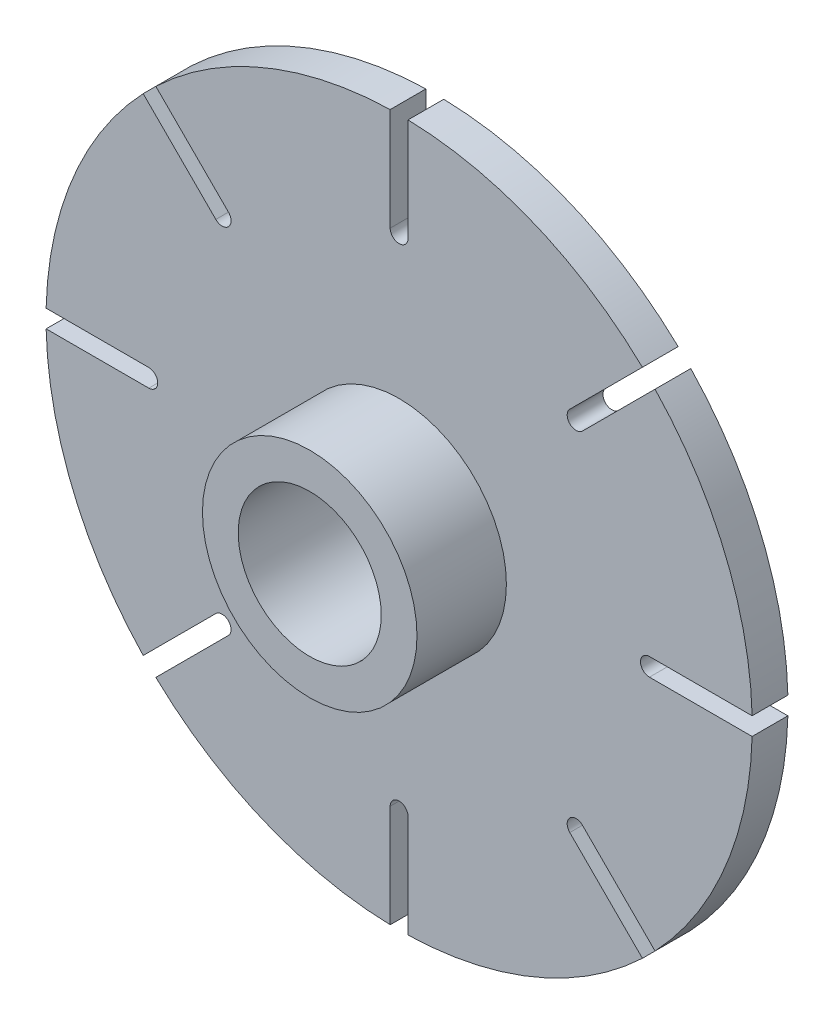
ISO-10303-21;
HEADER;
FILE_DESCRIPTION(('STEP AP214'),'2;1');
FILE_NAME('part.step','',(''),(''),'','','');
FILE_SCHEMA(('AUTOMOTIVE_DESIGN { 1 0 10303 214 1 1 1 1 }'));
ENDSEC;
DATA;
#1=APPLICATION_CONTEXT('core data for automotive mechanical design processes');
#2=APPLICATION_PROTOCOL_DEFINITION('international standard','automotive_design',2000,#1);
#3=PRODUCT_CONTEXT('',#1,'mechanical');
#4=PRODUCT('Part','Part','',(#3));
#5=PRODUCT_RELATED_PRODUCT_CATEGORY('part','',(#4));
#6=PRODUCT_DEFINITION_FORMATION('','',#4);
#7=PRODUCT_DEFINITION_CONTEXT('part definition',#1,'design');
#8=PRODUCT_DEFINITION('design','',#6,#7);
#9=PRODUCT_DEFINITION_SHAPE('','',#8);
#10=(LENGTH_UNIT() NAMED_UNIT(*) SI_UNIT(.MILLI.,.METRE.));
#11=(NAMED_UNIT(*) PLANE_ANGLE_UNIT() SI_UNIT($,.RADIAN.));
#12=(NAMED_UNIT(*) SI_UNIT($,.STERADIAN.) SOLID_ANGLE_UNIT());
#13=UNCERTAINTY_MEASURE_WITH_UNIT(LENGTH_MEASURE(1.E-05),#10,'distance_accuracy_value','');
#14=(GEOMETRIC_REPRESENTATION_CONTEXT(3) GLOBAL_UNCERTAINTY_ASSIGNED_CONTEXT((#13)) GLOBAL_UNIT_ASSIGNED_CONTEXT((#10,
#11,#12)) REPRESENTATION_CONTEXT('',''));
#15=CARTESIAN_POINT('',(0.,0.,0.));
#16=DIRECTION('',(0.,0.,1.));
#17=DIRECTION('',(1.,0.,0.));
#18=AXIS2_PLACEMENT_3D('',#15,#16,#17);
#19=CARTESIAN_POINT('',(0.,0.,7.));
#20=DIRECTION('',(0.,0.,-1.));
#21=DIRECTION('',(-1.,0.,0.));
#22=AXIS2_PLACEMENT_3D('',#19,#20,#21);
#23=CYLINDRICAL_SURFACE('',#22,6.);
#24=CARTESIAN_POINT('',(0.,0.,7.));
#25=DIRECTION('',(0.,0.,1.));
#26=DIRECTION('',(1.,0.,0.));
#27=AXIS2_PLACEMENT_3D('',#24,#25,#26);
#28=CIRCLE('',#27,6.);
#29=CARTESIAN_POINT('',(6.,0.,7.));
#30=VERTEX_POINT('',#29);
#31=EDGE_CURVE('E42',#30,#30,#28,.T.);
#32=ORIENTED_EDGE('',*,*,#31,.F.);
#33=EDGE_LOOP('',(#32));
#34=FACE_BOUND('',#33,.T.);
#35=CARTESIAN_POINT('',(0.,0.,2.));
#36=DIRECTION('',(0.,0.,-1.));
#37=DIRECTION('',(-1.,0.,0.));
#38=AXIS2_PLACEMENT_3D('',#35,#36,#37);
#39=CIRCLE('',#38,6.);
#40=CARTESIAN_POINT('',(-6.,0.,2.));
#41=VERTEX_POINT('',#40);
#42=EDGE_CURVE('E11',#41,#41,#39,.T.);
#43=ORIENTED_EDGE('',*,*,#42,.F.);
#44=EDGE_LOOP('',(#43));
#45=FACE_BOUND('',#44,.T.);
#46=ADVANCED_FACE('F34',(#34,#45),#23,.T.);
#47=CARTESIAN_POINT('',(0.,0.,7.));
#48=DIRECTION('',(0.,0.,1.));
#49=DIRECTION('',(1.,0.,0.));
#50=AXIS2_PLACEMENT_3D('',#47,#48,#49);
#51=PLANE('',#50);
#52=ORIENTED_EDGE('',*,*,#31,.T.);
#53=EDGE_LOOP('',(#52));
#54=FACE_BOUND('',#53,.T.);
#55=CARTESIAN_POINT('',(0.,0.,7.));
#56=DIRECTION('',(0.,0.,1.));
#57=DIRECTION('',(1.,0.,0.));
#58=AXIS2_PLACEMENT_3D('',#55,#56,#57);
#59=CIRCLE('',#58,4.);
#60=CARTESIAN_POINT('',(4.,0.,7.));
#61=VERTEX_POINT('',#60);
#62=EDGE_CURVE('E414',#61,#61,#59,.T.);
#63=ORIENTED_EDGE('',*,*,#62,.F.);
#64=EDGE_LOOP('',(#63));
#65=FACE_BOUND('',#64,.T.);
#66=ADVANCED_FACE('F421',(#54,#65),#51,.T.);
#67=CARTESIAN_POINT('',(0.,0.,0.));
#68=DIRECTION('',(0.,0.,1.));
#69=DIRECTION('',(1.,0.,0.));
#70=AXIS2_PLACEMENT_3D('',#67,#68,#69);
#71=PLANE('',#70);
#72=CARTESIAN_POINT('',(0.,0.,0.));
#73=DIRECTION('',(0.,0.,1.));
#74=DIRECTION('',(1.,0.,0.));
#75=AXIS2_PLACEMENT_3D('',#72,#73,#74);
#76=CIRCLE('',#75,4.);
#77=CARTESIAN_POINT('',(4.,0.,0.));
#78=VERTEX_POINT('',#77);
#79=EDGE_CURVE('E349',#78,#78,#76,.T.);
#80=ORIENTED_EDGE('',*,*,#79,.T.);
#81=EDGE_LOOP('',(#80));
#82=FACE_BOUND('',#81,.T.);
#83=DIRECTION('',(0.,1.,0.));
#84=VECTOR('',#83,1.);
#85=CARTESIAN_POINT('',(-0.5,0.,0.));
#86=LINE('',#85,#84);
#87=CARTESIAN_POINT('',(-0.5,14.,0.));
#88=VERTEX_POINT('',#87);
#89=CARTESIAN_POINT('',(-0.5,19.7436698716323,0.));
#90=VERTEX_POINT('',#89);
#91=EDGE_CURVE('E277',#88,#90,#86,.T.);
#92=ORIENTED_EDGE('',*,*,#91,.F.);
#93=CARTESIAN_POINT('',(0.,14.,0.));
#94=DIRECTION('',(0.,0.,-1.));
#95=DIRECTION('',(-1.,0.,0.));
#96=AXIS2_PLACEMENT_3D('',#93,#94,#95);
#97=CIRCLE('',#96,0.500000000000001);
#98=CARTESIAN_POINT('',(0.5,14.,0.));
#99=VERTEX_POINT('',#98);
#100=EDGE_CURVE('E279',#99,#88,#97,.T.);
#101=ORIENTED_EDGE('',*,*,#100,.F.);
#102=DIRECTION('',(0.,1.,0.));
#103=VECTOR('',#102,1.);
#104=CARTESIAN_POINT('',(0.5,0.,0.));
#105=LINE('',#104,#103);
#106=CARTESIAN_POINT('',(0.5,19.7436698716323,0.));
#107=VERTEX_POINT('',#106);
#108=EDGE_CURVE('E281',#99,#107,#105,.T.);
#109=ORIENTED_EDGE('',*,*,#108,.T.);
#110=CARTESIAN_POINT('',(0.,0.,0.));
#111=DIRECTION('',(0.,0.,-1.));
#112=DIRECTION('',(-1.,0.,0.));
#113=AXIS2_PLACEMENT_3D('',#110,#111,#112);
#114=CIRCLE('',#113,19.75);
#115=CARTESIAN_POINT('',(13.607329461146,14.3144362423321,0.));
#116=VERTEX_POINT('',#115);
#117=EDGE_CURVE('E284',#107,#116,#114,.T.);
#118=ORIENTED_EDGE('',*,*,#117,.T.);
#119=DIRECTION('',(0.707106781186548,0.707106781186547,0.));
#120=VECTOR('',#119,1.);
#121=CARTESIAN_POINT('',(-0.353553390593023,0.353553390593023,0.));
#122=LINE('',#121,#120);
#123=CARTESIAN_POINT('',(9.545941546018,10.253048327204,0.));
#124=VERTEX_POINT('',#123);
#125=EDGE_CURVE('E287',#124,#116,#122,.T.);
#126=ORIENTED_EDGE('',*,*,#125,.F.);
#127=CARTESIAN_POINT('',(9.89949493661127,9.89949493661076,0.));
#128=DIRECTION('',(0.,0.,-1.));
#129=DIRECTION('',(-1.,0.,0.));
#130=AXIS2_PLACEMENT_3D('',#127,#128,#129);
#131=CIRCLE('',#130,0.500000000000001);
#132=CARTESIAN_POINT('',(10.2530483272045,9.54594154601749,0.));
#133=VERTEX_POINT('',#132);
#134=EDGE_CURVE('E292',#133,#124,#131,.T.);
#135=ORIENTED_EDGE('',*,*,#134,.F.);
#136=DIRECTION('',(0.707106781186548,0.707106781186547,0.));
#137=VECTOR('',#136,1.);
#138=CARTESIAN_POINT('',(0.353553390593525,-0.353553390593525,0.));
#139=LINE('',#138,#137);
#140=CARTESIAN_POINT('',(14.3144362423326,13.6073294611455,0.));
#141=VERTEX_POINT('',#140);
#142=EDGE_CURVE('E294',#133,#141,#139,.T.);
#143=ORIENTED_EDGE('',*,*,#142,.T.);
#144=CARTESIAN_POINT('',(19.743669871631,0.499999999998734,0.));
#145=VERTEX_POINT('',#144);
#146=EDGE_CURVE('E289',#141,#145,#114,.T.);
#147=ORIENTED_EDGE('',*,*,#146,.T.);
#148=DIRECTION('',(1.,0.,0.));
#149=VECTOR('',#148,1.);
#150=CARTESIAN_POINT('',(0.,0.499999999998738,0.));
#151=LINE('',#150,#149);
#152=CARTESIAN_POINT('',(13.9999999999987,0.499999999998735,0.));
#153=VERTEX_POINT('',#152);
#154=EDGE_CURVE('E297',#153,#145,#151,.T.);
#155=ORIENTED_EDGE('',*,*,#154,.F.);
#156=CARTESIAN_POINT('',(13.9999999999987,-1.26481988006818E-12,0.));
#157=DIRECTION('',(0.,0.,-1.));
#158=DIRECTION('',(-1.,0.,0.));
#159=AXIS2_PLACEMENT_3D('',#156,#157,#158);
#160=CIRCLE('',#159,0.500000000000001);
#161=CARTESIAN_POINT('',(13.9999999999987,-0.500000000001265,0.));
#162=VERTEX_POINT('',#161);
#163=EDGE_CURVE('E300',#162,#153,#160,.T.);
#164=ORIENTED_EDGE('',*,*,#163,.F.);
#165=DIRECTION('',(1.,0.,0.));
#166=VECTOR('',#165,1.);
#167=CARTESIAN_POINT('',(0.,-0.500000000001262,0.));
#168=LINE('',#167,#166);
#169=CARTESIAN_POINT('',(19.743669871631,-0.500000000001266,0.));
#170=VERTEX_POINT('',#169);
#171=EDGE_CURVE('E302',#162,#170,#168,.T.);
#172=ORIENTED_EDGE('',*,*,#171,.T.);
#173=CARTESIAN_POINT('',(14.3144362423308,-13.6073294611473,0.));
#174=VERTEX_POINT('',#173);
#175=EDGE_CURVE('E305',#170,#174,#114,.T.);
#176=ORIENTED_EDGE('',*,*,#175,.T.);
#177=DIRECTION('',(0.707106781186547,-0.707106781186548,0.));
#178=VECTOR('',#177,1.);
#179=CARTESIAN_POINT('',(0.353553390591735,0.353553390591735,0.));
#180=LINE('',#179,#178);
#181=CARTESIAN_POINT('',(10.2530483272027,-9.54594154601926,0.));
#182=VERTEX_POINT('',#181);
#183=EDGE_CURVE('E306',#182,#174,#180,.T.);
#184=ORIENTED_EDGE('',*,*,#183,.F.);
#185=CARTESIAN_POINT('',(9.89949493660944,-9.89949493661253,0.));
#186=DIRECTION('',(0.,0.,-1.));
#187=DIRECTION('',(-1.,0.,0.));
#188=AXIS2_PLACEMENT_3D('',#185,#186,#187);
#189=CIRCLE('',#188,0.500000000000001);
#190=CARTESIAN_POINT('',(9.54594154601617,-10.2530483272058,0.));
#191=VERTEX_POINT('',#190);
#192=EDGE_CURVE('E309',#191,#182,#189,.T.);
#193=ORIENTED_EDGE('',*,*,#192,.F.);
#194=DIRECTION('',(0.707106781186547,-0.707106781186548,0.));
#195=VECTOR('',#194,1.);
#196=CARTESIAN_POINT('',(-0.353553390594814,-0.353553390594813,0.));
#197=LINE('',#196,#195);
#198=CARTESIAN_POINT('',(13.6073294611442,-14.3144362423339,0.));
#199=VERTEX_POINT('',#198);
#200=EDGE_CURVE('E311',#191,#199,#197,.T.);
#201=ORIENTED_EDGE('',*,*,#200,.T.);
#202=CARTESIAN_POINT('',(0.499999999997418,-19.7436698716322,0.));
#203=VERTEX_POINT('',#202);
#204=EDGE_CURVE('E314',#199,#203,#114,.T.);
#205=ORIENTED_EDGE('',*,*,#204,.T.);
#206=DIRECTION('',(0.,-1.,0.));
#207=VECTOR('',#206,1.);
#208=CARTESIAN_POINT('',(0.49999999999742,0.,0.));
#209=LINE('',#208,#207);
#210=CARTESIAN_POINT('',(0.499999999997418,-13.9999999999999,0.));
#211=VERTEX_POINT('',#210);
#212=EDGE_CURVE('E315',#211,#203,#209,.T.);
#213=ORIENTED_EDGE('',*,*,#212,.F.);
#214=CARTESIAN_POINT('',(-2.58172190033E-12,-13.9999999999999,0.));
#215=DIRECTION('',(0.,0.,-1.));
#216=DIRECTION('',(-1.,0.,0.));
#217=AXIS2_PLACEMENT_3D('',#214,#215,#216);
#218=CIRCLE('',#217,0.5);
#219=CARTESIAN_POINT('',(-0.500000000002582,-13.9999999999999,0.));
#220=VERTEX_POINT('',#219);
#221=EDGE_CURVE('E318',#220,#211,#218,.T.);
#222=ORIENTED_EDGE('',*,*,#221,.F.);
#223=DIRECTION('',(0.,-1.,0.));
#224=VECTOR('',#223,1.);
#225=CARTESIAN_POINT('',(-0.50000000000258,0.,0.));
#226=LINE('',#225,#224);
#227=CARTESIAN_POINT('',(-0.500000000002582,-19.7436698716322,0.));
#228=VERTEX_POINT('',#227);
#229=EDGE_CURVE('E320',#220,#228,#226,.T.);
#230=ORIENTED_EDGE('',*,*,#229,.T.);
#231=CARTESIAN_POINT('',(-13.6073294611486,-14.314436242332,0.));
#232=VERTEX_POINT('',#231);
#233=EDGE_CURVE('E323',#228,#232,#114,.T.);
#234=ORIENTED_EDGE('',*,*,#233,.T.);
#235=DIRECTION('',(-0.707106781186548,-0.707106781186548,0.));
#236=VECTOR('',#235,1.);
#237=CARTESIAN_POINT('',(0.353553390591703,-0.353553390591703,0.));
#238=LINE('',#237,#236);
#239=CARTESIAN_POINT('',(-9.54594154602058,-10.253048327204,0.));
#240=VERTEX_POINT('',#239);
#241=EDGE_CURVE('E324',#240,#232,#238,.T.);
#242=ORIENTED_EDGE('',*,*,#241,.F.);
#243=CARTESIAN_POINT('',(-9.89949493661385,-9.89949493661071,0.));
#244=DIRECTION('',(0.,0.,-1.));
#245=DIRECTION('',(-1.,0.,0.));
#246=AXIS2_PLACEMENT_3D('',#243,#244,#245);
#247=CIRCLE('',#246,0.500000000000001);
#248=CARTESIAN_POINT('',(-10.2530483272071,-9.54594154601743,0.));
#249=VERTEX_POINT('',#248);
#250=EDGE_CURVE('E327',#249,#240,#247,.T.);
#251=ORIENTED_EDGE('',*,*,#250,.F.);
#252=DIRECTION('',(-0.707106781186548,-0.707106781186548,0.));
#253=VECTOR('',#252,1.);
#254=CARTESIAN_POINT('',(-0.353553390594846,0.353553390594846,0.));
#255=LINE('',#254,#253);
#256=CARTESIAN_POINT('',(-14.3144362423352,-13.6073294611455,0.));
#257=VERTEX_POINT('',#256);
#258=EDGE_CURVE('E329',#249,#257,#255,.T.);
#259=ORIENTED_EDGE('',*,*,#258,.T.);
#260=CARTESIAN_POINT('',(-19.7436698716335,-0.499999999998681,0.));
#261=VERTEX_POINT('',#260);
#262=EDGE_CURVE('E332',#257,#261,#114,.T.);
#263=ORIENTED_EDGE('',*,*,#262,.T.);
#264=DIRECTION('',(-1.,0.,0.));
#265=VECTOR('',#264,1.);
#266=CARTESIAN_POINT('',(0.,-0.499999999998682,0.));
#267=LINE('',#266,#265);
#268=CARTESIAN_POINT('',(-14.0000000000013,-0.499999999998681,0.));
#269=VERTEX_POINT('',#268);
#270=EDGE_CURVE('E333',#269,#261,#267,.T.);
#271=ORIENTED_EDGE('',*,*,#270,.F.);
#272=CARTESIAN_POINT('',(-14.0000000000013,1.31861652578063E-12,0.));
#273=DIRECTION('',(0.,0.,-1.));
#274=DIRECTION('',(-1.,0.,0.));
#275=AXIS2_PLACEMENT_3D('',#272,#273,#274);
#276=CIRCLE('',#275,0.500000000000001);
#277=CARTESIAN_POINT('',(-14.0000000000013,0.500000000001319,0.));
#278=VERTEX_POINT('',#277);
#279=EDGE_CURVE('E336',#278,#269,#276,.T.);
#280=ORIENTED_EDGE('',*,*,#279,.F.);
#281=DIRECTION('',(-1.,0.,0.));
#282=VECTOR('',#281,1.);
#283=CARTESIAN_POINT('',(0.,0.500000000001318,0.));
#284=LINE('',#283,#282);
#285=CARTESIAN_POINT('',(-19.7436698716335,0.500000000001319,0.));
#286=VERTEX_POINT('',#285);
#287=EDGE_CURVE('E338',#278,#286,#284,.T.);
#288=ORIENTED_EDGE('',*,*,#287,.T.);
#289=CARTESIAN_POINT('',(-14.3144362423333,13.6073294611474,0.));
#290=VERTEX_POINT('',#289);
#291=EDGE_CURVE('E341',#286,#290,#114,.T.);
#292=ORIENTED_EDGE('',*,*,#291,.T.);
#293=DIRECTION('',(-0.707106781186548,0.707106781186548,0.));
#294=VECTOR('',#293,1.);
#295=CARTESIAN_POINT('',(-0.353553390592993,-0.353553390592993,0.));
#296=LINE('',#295,#294);
#297=CARTESIAN_POINT('',(-10.2530483272053,9.54594154601931,0.));
#298=VERTEX_POINT('',#297);
#299=EDGE_CURVE('E342',#298,#290,#296,.T.);
#300=ORIENTED_EDGE('',*,*,#299,.F.);
#301=CARTESIAN_POINT('',(-9.89949493661203,9.89949493661259,0.));
#302=DIRECTION('',(0.,0.,-1.));
#303=DIRECTION('',(-1.,0.,0.));
#304=AXIS2_PLACEMENT_3D('',#301,#302,#303);
#305=CIRCLE('',#304,0.500000000000001);
#306=CARTESIAN_POINT('',(-9.54594154601875,10.2530483272059,0.));
#307=VERTEX_POINT('',#306);
#308=EDGE_CURVE('E345',#307,#298,#305,.T.);
#309=ORIENTED_EDGE('',*,*,#308,.F.);
#310=DIRECTION('',(-0.707106781186548,0.707106781186548,0.));
#311=VECTOR('',#310,1.);
#312=CARTESIAN_POINT('',(0.353553390593556,0.353553390593556,0.));
#313=LINE('',#312,#311);
#314=CARTESIAN_POINT('',(-13.6073294611468,14.3144362423339,0.));
#315=VERTEX_POINT('',#314);
#316=EDGE_CURVE('E255',#307,#315,#313,.T.);
#317=ORIENTED_EDGE('',*,*,#316,.T.);
#318=EDGE_CURVE('E288',#315,#90,#114,.T.);
#319=ORIENTED_EDGE('',*,*,#318,.T.);
#320=EDGE_LOOP('',(#92,#101,#109,#118,#126,#135,#143,#147,#155,#164,#172,#176,#184,#193,#201,
#205,#213,#222,#230,#234,#242,#251,#259,#263,#271,#280,#288,#292,#300,#309,#317,#319));
#321=FACE_BOUND('',#320,.T.);
#322=ADVANCED_FACE('F537',(#82,#321),#71,.F.);
#323=CARTESIAN_POINT('',(0.,0.,7.));
#324=DIRECTION('',(0.,0.,-1.));
#325=DIRECTION('',(-1.,0.,0.));
#326=AXIS2_PLACEMENT_3D('',#323,#324,#325);
#327=CYLINDRICAL_SURFACE('',#326,4.);
#328=ORIENTED_EDGE('',*,*,#62,.T.);
#329=EDGE_LOOP('',(#328));
#330=FACE_BOUND('',#329,.T.);
#331=ORIENTED_EDGE('',*,*,#79,.F.);
#332=EDGE_LOOP('',(#331));
#333=FACE_BOUND('',#332,.T.);
#334=ADVANCED_FACE('F533',(#330,#333),#327,.F.);
#335=CARTESIAN_POINT('',(-0.5,0.,2.));
#336=DIRECTION('',(-1.,0.,0.));
#337=DIRECTION('',(0.,0.,1.));
#338=AXIS2_PLACEMENT_3D('',#335,#336,#337);
#339=PLANE('',#338);
#340=ORIENTED_EDGE('',*,*,#91,.T.);
#341=DIRECTION('',(0.,0.,-1.));
#342=VECTOR('',#341,1.);
#343=CARTESIAN_POINT('',(-0.5,19.7436698716323,2.));
#344=LINE('',#343,#342);
#345=CARTESIAN_POINT('',(-0.5,19.7436698716323,2.));
#346=VERTEX_POINT('',#345);
#347=EDGE_CURVE('E158',#346,#90,#344,.T.);
#348=ORIENTED_EDGE('',*,*,#347,.F.);
#349=DIRECTION('',(0.,1.,0.));
#350=VECTOR('',#349,1.);
#351=CARTESIAN_POINT('',(-0.5,0.,2.));
#352=LINE('',#351,#350);
#353=CARTESIAN_POINT('',(-0.5,14.,2.));
#354=VERTEX_POINT('',#353);
#355=EDGE_CURVE('E50',#354,#346,#352,.T.);
#356=ORIENTED_EDGE('',*,*,#355,.F.);
#357=DIRECTION('',(0.,0.,-1.));
#358=VECTOR('',#357,1.);
#359=CARTESIAN_POINT('',(-0.5,14.,2.));
#360=LINE('',#359,#358);
#361=EDGE_CURVE('E271',#354,#88,#360,.T.);
#362=ORIENTED_EDGE('',*,*,#361,.T.);
#363=EDGE_LOOP('',(#340,#348,#356,#362));
#364=FACE_BOUND('',#363,.T.);
#365=ADVANCED_FACE('F440',(#364),#339,.F.);
#366=CARTESIAN_POINT('',(0.,0.,2.));
#367=DIRECTION('',(0.,0.,-1.));
#368=DIRECTION('',(-1.,0.,0.));
#369=AXIS2_PLACEMENT_3D('',#366,#367,#368);
#370=CYLINDRICAL_SURFACE('',#369,19.75);
#371=ORIENTED_EDGE('',*,*,#318,.F.);
#372=DIRECTION('',(0.,0.,-1.));
#373=VECTOR('',#372,1.);
#374=CARTESIAN_POINT('',(-13.6073294611468,14.3144362423339,2.));
#375=LINE('',#374,#373);
#376=CARTESIAN_POINT('',(-13.6073294611468,14.3144362423339,2.));
#377=VERTEX_POINT('',#376);
#378=EDGE_CURVE('E151',#377,#315,#375,.T.);
#379=ORIENTED_EDGE('',*,*,#378,.F.);
#380=CARTESIAN_POINT('',(0.,0.,2.));
#381=DIRECTION('',(0.,0.,-1.));
#382=DIRECTION('',(-1.,0.,0.));
#383=AXIS2_PLACEMENT_3D('',#380,#381,#382);
#384=CIRCLE('',#383,19.75);
#385=EDGE_CURVE('E269',#377,#346,#384,.T.);
#386=ORIENTED_EDGE('',*,*,#385,.T.);
#387=ORIENTED_EDGE('',*,*,#347,.T.);
#388=EDGE_LOOP('',(#371,#379,#386,#387));
#389=FACE_BOUND('',#388,.T.);
#390=ADVANCED_FACE('F437',(#389),#370,.T.);
#391=CARTESIAN_POINT('',(0.353553390593556,0.353553390593556,2.));
#392=DIRECTION('',(-0.707106781186547,-0.707106781186547,0.));
#393=DIRECTION('',(0.707106781186548,-0.707106781186548,0.));
#394=AXIS2_PLACEMENT_3D('',#391,#392,#393);
#395=PLANE('',#394);
#396=ORIENTED_EDGE('',*,*,#316,.F.);
#397=DIRECTION('',(0.,0.,-1.));
#398=VECTOR('',#397,1.);
#399=CARTESIAN_POINT('',(-9.54594154601875,10.2530483272059,2.));
#400=LINE('',#399,#398);
#401=CARTESIAN_POINT('',(-9.54594154601875,10.2530483272059,2.));
#402=VERTEX_POINT('',#401);
#403=EDGE_CURVE('E250',#402,#307,#400,.T.);
#404=ORIENTED_EDGE('',*,*,#403,.F.);
#405=DIRECTION('',(-0.707106781186548,0.707106781186548,0.));
#406=VECTOR('',#405,1.);
#407=CARTESIAN_POINT('',(0.353553390593556,0.353553390593556,2.));
#408=LINE('',#407,#406);
#409=EDGE_CURVE('E254',#402,#377,#408,.T.);
#410=ORIENTED_EDGE('',*,*,#409,.T.);
#411=ORIENTED_EDGE('',*,*,#378,.T.);
#412=EDGE_LOOP('',(#396,#404,#410,#411));
#413=FACE_BOUND('',#412,.T.);
#414=ADVANCED_FACE('F252',(#413),#395,.T.);
#415=CARTESIAN_POINT('',(-9.89949493661203,9.89949493661259,2.));
#416=DIRECTION('',(0.,0.,-1.));
#417=DIRECTION('',(-1.,0.,0.));
#418=AXIS2_PLACEMENT_3D('',#415,#416,#417);
#419=CYLINDRICAL_SURFACE('',#418,0.500000000000001);
#420=ORIENTED_EDGE('',*,*,#308,.T.);
#421=DIRECTION('',(0.,0.,-1.));
#422=VECTOR('',#421,1.);
#423=CARTESIAN_POINT('',(-10.2530483272053,9.54594154601931,2.));
#424=LINE('',#423,#422);
#425=CARTESIAN_POINT('',(-10.2530483272053,9.54594154601931,2.));
#426=VERTEX_POINT('',#425);
#427=EDGE_CURVE('E258',#426,#298,#424,.T.);
#428=ORIENTED_EDGE('',*,*,#427,.F.);
#429=CARTESIAN_POINT('',(-9.89949493661203,9.89949493661259,2.));
#430=DIRECTION('',(0.,0.,-1.));
#431=DIRECTION('',(-1.,0.,0.));
#432=AXIS2_PLACEMENT_3D('',#429,#430,#431);
#433=CIRCLE('',#432,0.500000000000001);
#434=EDGE_CURVE('E261',#402,#426,#433,.T.);
#435=ORIENTED_EDGE('',*,*,#434,.F.);
#436=ORIENTED_EDGE('',*,*,#403,.T.);
#437=EDGE_LOOP('',(#420,#428,#435,#436));
#438=FACE_BOUND('',#437,.T.);
#439=ADVANCED_FACE('F262',(#438),#419,.F.);
#440=CARTESIAN_POINT('',(-0.353553390592993,-0.353553390592993,2.));
#441=DIRECTION('',(-0.707106781186547,-0.707106781186547,0.));
#442=DIRECTION('',(0.707106781186548,-0.707106781186548,0.));
#443=AXIS2_PLACEMENT_3D('',#440,#441,#442);
#444=PLANE('',#443);
#445=ORIENTED_EDGE('',*,*,#299,.T.);
#446=DIRECTION('',(0.,0.,-1.));
#447=VECTOR('',#446,1.);
#448=CARTESIAN_POINT('',(-14.3144362423333,13.6073294611474,2.));
#449=LINE('',#448,#447);
#450=CARTESIAN_POINT('',(-14.3144362423333,13.6073294611474,2.));
#451=VERTEX_POINT('',#450);
#452=EDGE_CURVE('E352',#451,#290,#449,.T.);
#453=ORIENTED_EDGE('',*,*,#452,.F.);
#454=DIRECTION('',(-0.707106781186548,0.707106781186548,0.));
#455=VECTOR('',#454,1.);
#456=CARTESIAN_POINT('',(-0.353553390592993,-0.353553390592993,2.));
#457=LINE('',#456,#455);
#458=EDGE_CURVE('E265',#426,#451,#457,.T.);
#459=ORIENTED_EDGE('',*,*,#458,.F.);
#460=ORIENTED_EDGE('',*,*,#427,.T.);
#461=EDGE_LOOP('',(#445,#453,#459,#460));
#462=FACE_BOUND('',#461,.T.);
#463=ADVANCED_FACE('F447',(#462),#444,.F.);
#464=ORIENTED_EDGE('',*,*,#291,.F.);
#465=DIRECTION('',(0.,0.,-1.));
#466=VECTOR('',#465,1.);
#467=CARTESIAN_POINT('',(-19.7436698716335,0.500000000001319,2.));
#468=LINE('',#467,#466);
#469=CARTESIAN_POINT('',(-19.7436698716335,0.500000000001319,2.));
#470=VERTEX_POINT('',#469);
#471=EDGE_CURVE('E354',#470,#286,#468,.T.);
#472=ORIENTED_EDGE('',*,*,#471,.F.);
#473=EDGE_CURVE('E273',#470,#451,#384,.T.);
#474=ORIENTED_EDGE('',*,*,#473,.T.);
#475=ORIENTED_EDGE('',*,*,#452,.T.);
#476=EDGE_LOOP('',(#464,#472,#474,#475));
#477=FACE_BOUND('',#476,.T.);
#478=ADVANCED_FACE('F442',(#477),#370,.T.);
#479=CARTESIAN_POINT('',(0.,0.500000000001318,2.));
#480=DIRECTION('',(0.,-1.,0.));
#481=DIRECTION('',(1.,0.,0.));
#482=AXIS2_PLACEMENT_3D('',#479,#480,#481);
#483=PLANE('',#482);
#484=ORIENTED_EDGE('',*,*,#287,.F.);
#485=DIRECTION('',(0.,0.,-1.));
#486=VECTOR('',#485,1.);
#487=CARTESIAN_POINT('',(-14.0000000000013,0.500000000001319,2.));
#488=LINE('',#487,#486);
#489=CARTESIAN_POINT('',(-14.0000000000013,0.500000000001319,2.));
#490=VERTEX_POINT('',#489);
#491=EDGE_CURVE('E356',#490,#278,#488,.T.);
#492=ORIENTED_EDGE('',*,*,#491,.F.);
#493=DIRECTION('',(-1.,0.,0.));
#494=VECTOR('',#493,1.);
#495=CARTESIAN_POINT('',(0.,0.500000000001318,2.));
#496=LINE('',#495,#494);
#497=EDGE_CURVE('E634',#490,#470,#496,.T.);
#498=ORIENTED_EDGE('',*,*,#497,.T.);
#499=ORIENTED_EDGE('',*,*,#471,.T.);
#500=EDGE_LOOP('',(#484,#492,#498,#499));
#501=FACE_BOUND('',#500,.T.);
#502=ADVANCED_FACE('F451',(#501),#483,.T.);
#503=CARTESIAN_POINT('',(-14.0000000000013,1.31861652578063E-12,2.));
#504=DIRECTION('',(0.,0.,-1.));
#505=DIRECTION('',(-1.,0.,0.));
#506=AXIS2_PLACEMENT_3D('',#503,#504,#505);
#507=CYLINDRICAL_SURFACE('',#506,0.500000000000001);
#508=ORIENTED_EDGE('',*,*,#279,.T.);
#509=DIRECTION('',(0.,0.,-1.));
#510=VECTOR('',#509,1.);
#511=CARTESIAN_POINT('',(-14.0000000000013,-0.499999999998681,2.));
#512=LINE('',#511,#510);
#513=CARTESIAN_POINT('',(-14.0000000000013,-0.499999999998681,2.));
#514=VERTEX_POINT('',#513);
#515=EDGE_CURVE('E358',#514,#269,#512,.T.);
#516=ORIENTED_EDGE('',*,*,#515,.F.);
#517=CARTESIAN_POINT('',(-14.0000000000013,1.31861652578063E-12,2.));
#518=DIRECTION('',(0.,0.,-1.));
#519=DIRECTION('',(-1.,0.,0.));
#520=AXIS2_PLACEMENT_3D('',#517,#518,#519);
#521=CIRCLE('',#520,0.500000000000001);
#522=EDGE_CURVE('E632',#490,#514,#521,.T.);
#523=ORIENTED_EDGE('',*,*,#522,.F.);
#524=ORIENTED_EDGE('',*,*,#491,.T.);
#525=EDGE_LOOP('',(#508,#516,#523,#524));
#526=FACE_BOUND('',#525,.T.);
#527=ADVANCED_FACE('F454',(#526),#507,.F.);
#528=CARTESIAN_POINT('',(0.,-0.499999999998682,2.));
#529=DIRECTION('',(0.,-1.,0.));
#530=DIRECTION('',(1.,0.,0.));
#531=AXIS2_PLACEMENT_3D('',#528,#529,#530);
#532=PLANE('',#531);
#533=ORIENTED_EDGE('',*,*,#270,.T.);
#534=DIRECTION('',(0.,0.,-1.));
#535=VECTOR('',#534,1.);
#536=CARTESIAN_POINT('',(-19.7436698716335,-0.499999999998681,2.));
#537=LINE('',#536,#535);
#538=CARTESIAN_POINT('',(-19.7436698716335,-0.499999999998681,2.));
#539=VERTEX_POINT('',#538);
#540=EDGE_CURVE('E361',#539,#261,#537,.T.);
#541=ORIENTED_EDGE('',*,*,#540,.F.);
#542=DIRECTION('',(-1.,0.,0.));
#543=VECTOR('',#542,1.);
#544=CARTESIAN_POINT('',(0.,-0.499999999998682,2.));
#545=LINE('',#544,#543);
#546=EDGE_CURVE('E630',#514,#539,#545,.T.);
#547=ORIENTED_EDGE('',*,*,#546,.F.);
#548=ORIENTED_EDGE('',*,*,#515,.T.);
#549=EDGE_LOOP('',(#533,#541,#547,#548));
#550=FACE_BOUND('',#549,.T.);
#551=ADVANCED_FACE('F458',(#550),#532,.F.);
#552=ORIENTED_EDGE('',*,*,#262,.F.);
#553=DIRECTION('',(0.,0.,-1.));
#554=VECTOR('',#553,1.);
#555=CARTESIAN_POINT('',(-14.3144362423352,-13.6073294611455,2.));
#556=LINE('',#555,#554);
#557=CARTESIAN_POINT('',(-14.3144362423352,-13.6073294611455,2.));
#558=VERTEX_POINT('',#557);
#559=EDGE_CURVE('E363',#558,#257,#556,.T.);
#560=ORIENTED_EDGE('',*,*,#559,.F.);
#561=EDGE_CURVE('E629',#558,#539,#384,.T.);
#562=ORIENTED_EDGE('',*,*,#561,.T.);
#563=ORIENTED_EDGE('',*,*,#540,.T.);
#564=EDGE_LOOP('',(#552,#560,#562,#563));
#565=FACE_BOUND('',#564,.T.);
#566=ADVANCED_FACE('F462',(#565),#370,.T.);
#567=CARTESIAN_POINT('',(-0.353553390594846,0.353553390594846,2.));
#568=DIRECTION('',(0.707106781186547,-0.707106781186547,0.));
#569=DIRECTION('',(0.707106781186548,0.707106781186548,0.));
#570=AXIS2_PLACEMENT_3D('',#567,#568,#569);
#571=PLANE('',#570);
#572=ORIENTED_EDGE('',*,*,#258,.F.);
#573=DIRECTION('',(0.,0.,-1.));
#574=VECTOR('',#573,1.);
#575=CARTESIAN_POINT('',(-10.2530483272071,-9.54594154601743,2.));
#576=LINE('',#575,#574);
#577=CARTESIAN_POINT('',(-10.2530483272071,-9.54594154601743,2.));
#578=VERTEX_POINT('',#577);
#579=EDGE_CURVE('E365',#578,#249,#576,.T.);
#580=ORIENTED_EDGE('',*,*,#579,.F.);
#581=DIRECTION('',(-0.707106781186548,-0.707106781186548,0.));
#582=VECTOR('',#581,1.);
#583=CARTESIAN_POINT('',(-0.353553390594846,0.353553390594846,2.));
#584=LINE('',#583,#582);
#585=EDGE_CURVE('E626',#578,#558,#584,.T.);
#586=ORIENTED_EDGE('',*,*,#585,.T.);
#587=ORIENTED_EDGE('',*,*,#559,.T.);
#588=EDGE_LOOP('',(#572,#580,#586,#587));
#589=FACE_BOUND('',#588,.T.);
#590=ADVANCED_FACE('F464',(#589),#571,.T.);
#591=CARTESIAN_POINT('',(-9.89949493661385,-9.89949493661071,2.));
#592=DIRECTION('',(0.,0.,-1.));
#593=DIRECTION('',(-1.,0.,0.));
#594=AXIS2_PLACEMENT_3D('',#591,#592,#593);
#595=CYLINDRICAL_SURFACE('',#594,0.500000000000001);
#596=ORIENTED_EDGE('',*,*,#250,.T.);
#597=DIRECTION('',(0.,0.,-1.));
#598=VECTOR('',#597,1.);
#599=CARTESIAN_POINT('',(-9.54594154602058,-10.253048327204,2.));
#600=LINE('',#599,#598);
#601=CARTESIAN_POINT('',(-9.54594154602058,-10.253048327204,2.));
#602=VERTEX_POINT('',#601);
#603=EDGE_CURVE('E367',#602,#240,#600,.T.);
#604=ORIENTED_EDGE('',*,*,#603,.F.);
#605=CARTESIAN_POINT('',(-9.89949493661385,-9.89949493661071,2.));
#606=DIRECTION('',(0.,0.,-1.));
#607=DIRECTION('',(-1.,0.,0.));
#608=AXIS2_PLACEMENT_3D('',#605,#606,#607);
#609=CIRCLE('',#608,0.500000000000001);
#610=EDGE_CURVE('E624',#578,#602,#609,.T.);
#611=ORIENTED_EDGE('',*,*,#610,.F.);
#612=ORIENTED_EDGE('',*,*,#579,.T.);
#613=EDGE_LOOP('',(#596,#604,#611,#612));
#614=FACE_BOUND('',#613,.T.);
#615=ADVANCED_FACE('F467',(#614),#595,.F.);
#616=CARTESIAN_POINT('',(0.353553390591703,-0.353553390591703,2.));
#617=DIRECTION('',(0.707106781186547,-0.707106781186547,0.));
#618=DIRECTION('',(0.707106781186548,0.707106781186548,0.));
#619=AXIS2_PLACEMENT_3D('',#616,#617,#618);
#620=PLANE('',#619);
#621=ORIENTED_EDGE('',*,*,#241,.T.);
#622=DIRECTION('',(0.,0.,-1.));
#623=VECTOR('',#622,1.);
#624=CARTESIAN_POINT('',(-13.6073294611486,-14.314436242332,2.));
#625=LINE('',#624,#623);
#626=CARTESIAN_POINT('',(-13.6073294611486,-14.314436242332,2.));
#627=VERTEX_POINT('',#626);
#628=EDGE_CURVE('E370',#627,#232,#625,.T.);
#629=ORIENTED_EDGE('',*,*,#628,.F.);
#630=DIRECTION('',(-0.707106781186548,-0.707106781186548,0.));
#631=VECTOR('',#630,1.);
#632=CARTESIAN_POINT('',(0.353553390591703,-0.353553390591703,2.));
#633=LINE('',#632,#631);
#634=EDGE_CURVE('E622',#602,#627,#633,.T.);
#635=ORIENTED_EDGE('',*,*,#634,.F.);
#636=ORIENTED_EDGE('',*,*,#603,.T.);
#637=EDGE_LOOP('',(#621,#629,#635,#636));
#638=FACE_BOUND('',#637,.T.);
#639=ADVANCED_FACE('F471',(#638),#620,.F.);
#640=ORIENTED_EDGE('',*,*,#233,.F.);
#641=DIRECTION('',(0.,0.,-1.));
#642=VECTOR('',#641,1.);
#643=CARTESIAN_POINT('',(-0.500000000002582,-19.7436698716322,2.));
#644=LINE('',#643,#642);
#645=CARTESIAN_POINT('',(-0.500000000002582,-19.7436698716322,2.));
#646=VERTEX_POINT('',#645);
#647=EDGE_CURVE('E372',#646,#228,#644,.T.);
#648=ORIENTED_EDGE('',*,*,#647,.F.);
#649=EDGE_CURVE('E621',#646,#627,#384,.T.);
#650=ORIENTED_EDGE('',*,*,#649,.T.);
#651=ORIENTED_EDGE('',*,*,#628,.T.);
#652=EDGE_LOOP('',(#640,#648,#650,#651));
#653=FACE_BOUND('',#652,.T.);
#654=ADVANCED_FACE('F475',(#653),#370,.T.);
#655=CARTESIAN_POINT('',(-0.50000000000258,0.,2.));
#656=DIRECTION('',(1.,0.,0.));
#657=DIRECTION('',(0.,1.,0.));
#658=AXIS2_PLACEMENT_3D('',#655,#656,#657);
#659=PLANE('',#658);
#660=ORIENTED_EDGE('',*,*,#229,.F.);
#661=DIRECTION('',(0.,0.,-1.));
#662=VECTOR('',#661,1.);
#663=CARTESIAN_POINT('',(-0.500000000002582,-13.9999999999999,2.));
#664=LINE('',#663,#662);
#665=CARTESIAN_POINT('',(-0.500000000002582,-13.9999999999999,2.));
#666=VERTEX_POINT('',#665);
#667=EDGE_CURVE('E374',#666,#220,#664,.T.);
#668=ORIENTED_EDGE('',*,*,#667,.F.);
#669=DIRECTION('',(0.,-1.,0.));
#670=VECTOR('',#669,1.);
#671=CARTESIAN_POINT('',(-0.50000000000258,0.,2.));
#672=LINE('',#671,#670);
#673=EDGE_CURVE('E618',#666,#646,#672,.T.);
#674=ORIENTED_EDGE('',*,*,#673,.T.);
#675=ORIENTED_EDGE('',*,*,#647,.T.);
#676=EDGE_LOOP('',(#660,#668,#674,#675));
#677=FACE_BOUND('',#676,.T.);
#678=ADVANCED_FACE('F477',(#677),#659,.T.);
#679=CARTESIAN_POINT('',(-2.58172190033E-12,-13.9999999999999,2.));
#680=DIRECTION('',(0.,0.,-1.));
#681=DIRECTION('',(-1.,0.,0.));
#682=AXIS2_PLACEMENT_3D('',#679,#680,#681);
#683=CYLINDRICAL_SURFACE('',#682,0.5);
#684=ORIENTED_EDGE('',*,*,#221,.T.);
#685=DIRECTION('',(0.,0.,-1.));
#686=VECTOR('',#685,1.);
#687=CARTESIAN_POINT('',(0.499999999997418,-13.9999999999999,2.));
#688=LINE('',#687,#686);
#689=CARTESIAN_POINT('',(0.499999999997418,-13.9999999999999,2.));
#690=VERTEX_POINT('',#689);
#691=EDGE_CURVE('E376',#690,#211,#688,.T.);
#692=ORIENTED_EDGE('',*,*,#691,.F.);
#693=CARTESIAN_POINT('',(-2.58172190033E-12,-13.9999999999999,2.));
#694=DIRECTION('',(0.,0.,-1.));
#695=DIRECTION('',(-1.,0.,0.));
#696=AXIS2_PLACEMENT_3D('',#693,#694,#695);
#697=CIRCLE('',#696,0.5);
#698=EDGE_CURVE('E616',#666,#690,#697,.T.);
#699=ORIENTED_EDGE('',*,*,#698,.F.);
#700=ORIENTED_EDGE('',*,*,#667,.T.);
#701=EDGE_LOOP('',(#684,#692,#699,#700));
#702=FACE_BOUND('',#701,.T.);
#703=ADVANCED_FACE('F480',(#702),#683,.F.);
#704=CARTESIAN_POINT('',(0.49999999999742,0.,2.));
#705=DIRECTION('',(1.,0.,0.));
#706=DIRECTION('',(0.,1.,0.));
#707=AXIS2_PLACEMENT_3D('',#704,#705,#706);
#708=PLANE('',#707);
#709=ORIENTED_EDGE('',*,*,#212,.T.);
#710=DIRECTION('',(0.,0.,-1.));
#711=VECTOR('',#710,1.);
#712=CARTESIAN_POINT('',(0.499999999997418,-19.7436698716322,2.));
#713=LINE('',#712,#711);
#714=CARTESIAN_POINT('',(0.499999999997418,-19.7436698716322,2.));
#715=VERTEX_POINT('',#714);
#716=EDGE_CURVE('E379',#715,#203,#713,.T.);
#717=ORIENTED_EDGE('',*,*,#716,.F.);
#718=DIRECTION('',(0.,-1.,0.));
#719=VECTOR('',#718,1.);
#720=CARTESIAN_POINT('',(0.49999999999742,0.,2.));
#721=LINE('',#720,#719);
#722=EDGE_CURVE('E614',#690,#715,#721,.T.);
#723=ORIENTED_EDGE('',*,*,#722,.F.);
#724=ORIENTED_EDGE('',*,*,#691,.T.);
#725=EDGE_LOOP('',(#709,#717,#723,#724));
#726=FACE_BOUND('',#725,.T.);
#727=ADVANCED_FACE('F484',(#726),#708,.F.);
#728=ORIENTED_EDGE('',*,*,#204,.F.);
#729=DIRECTION('',(0.,0.,-1.));
#730=VECTOR('',#729,1.);
#731=CARTESIAN_POINT('',(13.6073294611442,-14.3144362423339,2.));
#732=LINE('',#731,#730);
#733=CARTESIAN_POINT('',(13.6073294611442,-14.3144362423339,2.));
#734=VERTEX_POINT('',#733);
#735=EDGE_CURVE('E381',#734,#199,#732,.T.);
#736=ORIENTED_EDGE('',*,*,#735,.F.);
#737=EDGE_CURVE('E613',#734,#715,#384,.T.);
#738=ORIENTED_EDGE('',*,*,#737,.T.);
#739=ORIENTED_EDGE('',*,*,#716,.T.);
#740=EDGE_LOOP('',(#728,#736,#738,#739));
#741=FACE_BOUND('',#740,.T.);
#742=ADVANCED_FACE('F488',(#741),#370,.T.);
#743=CARTESIAN_POINT('',(-0.353553390594814,-0.353553390594813,2.));
#744=DIRECTION('',(0.707106781186548,0.707106781186547,0.));
#745=DIRECTION('',(-0.707106781186547,0.707106781186548,0.));
#746=AXIS2_PLACEMENT_3D('',#743,#744,#745);
#747=PLANE('',#746);
#748=ORIENTED_EDGE('',*,*,#200,.F.);
#749=DIRECTION('',(0.,0.,-1.));
#750=VECTOR('',#749,1.);
#751=CARTESIAN_POINT('',(9.54594154601617,-10.2530483272058,2.));
#752=LINE('',#751,#750);
#753=CARTESIAN_POINT('',(9.54594154601617,-10.2530483272058,2.));
#754=VERTEX_POINT('',#753);
#755=EDGE_CURVE('E383',#754,#191,#752,.T.);
#756=ORIENTED_EDGE('',*,*,#755,.F.);
#757=DIRECTION('',(0.707106781186547,-0.707106781186548,0.));
#758=VECTOR('',#757,1.);
#759=CARTESIAN_POINT('',(-0.353553390594814,-0.353553390594813,2.));
#760=LINE('',#759,#758);
#761=EDGE_CURVE('E610',#754,#734,#760,.T.);
#762=ORIENTED_EDGE('',*,*,#761,.T.);
#763=ORIENTED_EDGE('',*,*,#735,.T.);
#764=EDGE_LOOP('',(#748,#756,#762,#763));
#765=FACE_BOUND('',#764,.T.);
#766=ADVANCED_FACE('F490',(#765),#747,.T.);
#767=CARTESIAN_POINT('',(9.89949493660944,-9.89949493661253,2.));
#768=DIRECTION('',(0.,0.,-1.));
#769=DIRECTION('',(-1.,0.,0.));
#770=AXIS2_PLACEMENT_3D('',#767,#768,#769);
#771=CYLINDRICAL_SURFACE('',#770,0.500000000000001);
#772=ORIENTED_EDGE('',*,*,#192,.T.);
#773=DIRECTION('',(0.,0.,-1.));
#774=VECTOR('',#773,1.);
#775=CARTESIAN_POINT('',(10.2530483272027,-9.54594154601926,2.));
#776=LINE('',#775,#774);
#777=CARTESIAN_POINT('',(10.2530483272027,-9.54594154601926,2.));
#778=VERTEX_POINT('',#777);
#779=EDGE_CURVE('E385',#778,#182,#776,.T.);
#780=ORIENTED_EDGE('',*,*,#779,.F.);
#781=CARTESIAN_POINT('',(9.89949493660944,-9.89949493661253,2.));
#782=DIRECTION('',(0.,0.,-1.));
#783=DIRECTION('',(-1.,0.,0.));
#784=AXIS2_PLACEMENT_3D('',#781,#782,#783);
#785=CIRCLE('',#784,0.500000000000001);
#786=EDGE_CURVE('E608',#754,#778,#785,.T.);
#787=ORIENTED_EDGE('',*,*,#786,.F.);
#788=ORIENTED_EDGE('',*,*,#755,.T.);
#789=EDGE_LOOP('',(#772,#780,#787,#788));
#790=FACE_BOUND('',#789,.T.);
#791=ADVANCED_FACE('F493',(#790),#771,.F.);
#792=CARTESIAN_POINT('',(0.353553390591735,0.353553390591735,2.));
#793=DIRECTION('',(0.707106781186548,0.707106781186547,0.));
#794=DIRECTION('',(-0.707106781186547,0.707106781186548,0.));
#795=AXIS2_PLACEMENT_3D('',#792,#793,#794);
#796=PLANE('',#795);
#797=ORIENTED_EDGE('',*,*,#183,.T.);
#798=DIRECTION('',(0.,0.,-1.));
#799=VECTOR('',#798,1.);
#800=CARTESIAN_POINT('',(14.3144362423308,-13.6073294611473,2.));
#801=LINE('',#800,#799);
#802=CARTESIAN_POINT('',(14.3144362423308,-13.6073294611473,2.));
#803=VERTEX_POINT('',#802);
#804=EDGE_CURVE('E388',#803,#174,#801,.T.);
#805=ORIENTED_EDGE('',*,*,#804,.F.);
#806=DIRECTION('',(0.707106781186547,-0.707106781186548,0.));
#807=VECTOR('',#806,1.);
#808=CARTESIAN_POINT('',(0.353553390591735,0.353553390591735,2.));
#809=LINE('',#808,#807);
#810=EDGE_CURVE('E606',#778,#803,#809,.T.);
#811=ORIENTED_EDGE('',*,*,#810,.F.);
#812=ORIENTED_EDGE('',*,*,#779,.T.);
#813=EDGE_LOOP('',(#797,#805,#811,#812));
#814=FACE_BOUND('',#813,.T.);
#815=ADVANCED_FACE('F497',(#814),#796,.F.);
#816=ORIENTED_EDGE('',*,*,#175,.F.);
#817=DIRECTION('',(0.,0.,-1.));
#818=VECTOR('',#817,1.);
#819=CARTESIAN_POINT('',(19.743669871631,-0.500000000001266,2.));
#820=LINE('',#819,#818);
#821=CARTESIAN_POINT('',(19.743669871631,-0.500000000001266,2.));
#822=VERTEX_POINT('',#821);
#823=EDGE_CURVE('E390',#822,#170,#820,.T.);
#824=ORIENTED_EDGE('',*,*,#823,.F.);
#825=EDGE_CURVE('E605',#822,#803,#384,.T.);
#826=ORIENTED_EDGE('',*,*,#825,.T.);
#827=ORIENTED_EDGE('',*,*,#804,.T.);
#828=EDGE_LOOP('',(#816,#824,#826,#827));
#829=FACE_BOUND('',#828,.T.);
#830=ADVANCED_FACE('F501',(#829),#370,.T.);
#831=CARTESIAN_POINT('',(0.,-0.500000000001262,2.));
#832=DIRECTION('',(0.,1.,0.));
#833=DIRECTION('',(-1.,0.,0.));
#834=AXIS2_PLACEMENT_3D('',#831,#832,#833);
#835=PLANE('',#834);
#836=ORIENTED_EDGE('',*,*,#171,.F.);
#837=DIRECTION('',(0.,0.,-1.));
#838=VECTOR('',#837,1.);
#839=CARTESIAN_POINT('',(13.9999999999987,-0.500000000001265,2.));
#840=LINE('',#839,#838);
#841=CARTESIAN_POINT('',(13.9999999999987,-0.500000000001265,2.));
#842=VERTEX_POINT('',#841);
#843=EDGE_CURVE('E392',#842,#162,#840,.T.);
#844=ORIENTED_EDGE('',*,*,#843,.F.);
#845=DIRECTION('',(1.,0.,0.));
#846=VECTOR('',#845,1.);
#847=CARTESIAN_POINT('',(0.,-0.500000000001262,2.));
#848=LINE('',#847,#846);
#849=EDGE_CURVE('E602',#842,#822,#848,.T.);
#850=ORIENTED_EDGE('',*,*,#849,.T.);
#851=ORIENTED_EDGE('',*,*,#823,.T.);
#852=EDGE_LOOP('',(#836,#844,#850,#851));
#853=FACE_BOUND('',#852,.T.);
#854=ADVANCED_FACE('F503',(#853),#835,.T.);
#855=CARTESIAN_POINT('',(13.9999999999987,-1.26481988006818E-12,2.));
#856=DIRECTION('',(0.,0.,-1.));
#857=DIRECTION('',(-1.,0.,0.));
#858=AXIS2_PLACEMENT_3D('',#855,#856,#857);
#859=CYLINDRICAL_SURFACE('',#858,0.500000000000001);
#860=ORIENTED_EDGE('',*,*,#163,.T.);
#861=DIRECTION('',(0.,0.,-1.));
#862=VECTOR('',#861,1.);
#863=CARTESIAN_POINT('',(13.9999999999987,0.499999999998735,2.));
#864=LINE('',#863,#862);
#865=CARTESIAN_POINT('',(13.9999999999987,0.499999999998735,2.));
#866=VERTEX_POINT('',#865);
#867=EDGE_CURVE('E394',#866,#153,#864,.T.);
#868=ORIENTED_EDGE('',*,*,#867,.F.);
#869=CARTESIAN_POINT('',(13.9999999999987,-1.26481988006818E-12,2.));
#870=DIRECTION('',(0.,0.,-1.));
#871=DIRECTION('',(-1.,0.,0.));
#872=AXIS2_PLACEMENT_3D('',#869,#870,#871);
#873=CIRCLE('',#872,0.500000000000001);
#874=EDGE_CURVE('E600',#842,#866,#873,.T.);
#875=ORIENTED_EDGE('',*,*,#874,.F.);
#876=ORIENTED_EDGE('',*,*,#843,.T.);
#877=EDGE_LOOP('',(#860,#868,#875,#876));
#878=FACE_BOUND('',#877,.T.);
#879=ADVANCED_FACE('F506',(#878),#859,.F.);
#880=CARTESIAN_POINT('',(0.,0.499999999998738,2.));
#881=DIRECTION('',(0.,1.,0.));
#882=DIRECTION('',(-1.,0.,0.));
#883=AXIS2_PLACEMENT_3D('',#880,#881,#882);
#884=PLANE('',#883);
#885=ORIENTED_EDGE('',*,*,#154,.T.);
#886=DIRECTION('',(0.,0.,-1.));
#887=VECTOR('',#886,1.);
#888=CARTESIAN_POINT('',(19.743669871631,0.499999999998734,2.));
#889=LINE('',#888,#887);
#890=CARTESIAN_POINT('',(19.743669871631,0.499999999998734,2.));
#891=VERTEX_POINT('',#890);
#892=EDGE_CURVE('E397',#891,#145,#889,.T.);
#893=ORIENTED_EDGE('',*,*,#892,.F.);
#894=DIRECTION('',(1.,0.,0.));
#895=VECTOR('',#894,1.);
#896=CARTESIAN_POINT('',(0.,0.499999999998738,2.));
#897=LINE('',#896,#895);
#898=EDGE_CURVE('E598',#866,#891,#897,.T.);
#899=ORIENTED_EDGE('',*,*,#898,.F.);
#900=ORIENTED_EDGE('',*,*,#867,.T.);
#901=EDGE_LOOP('',(#885,#893,#899,#900));
#902=FACE_BOUND('',#901,.T.);
#903=ADVANCED_FACE('F510',(#902),#884,.F.);
#904=ORIENTED_EDGE('',*,*,#146,.F.);
#905=DIRECTION('',(0.,0.,-1.));
#906=VECTOR('',#905,1.);
#907=CARTESIAN_POINT('',(14.3144362423326,13.6073294611455,2.));
#908=LINE('',#907,#906);
#909=CARTESIAN_POINT('',(14.3144362423326,13.6073294611455,2.));
#910=VERTEX_POINT('',#909);
#911=EDGE_CURVE('E399',#910,#141,#908,.T.);
#912=ORIENTED_EDGE('',*,*,#911,.F.);
#913=EDGE_CURVE('E594',#910,#891,#384,.T.);
#914=ORIENTED_EDGE('',*,*,#913,.T.);
#915=ORIENTED_EDGE('',*,*,#892,.T.);
#916=EDGE_LOOP('',(#904,#912,#914,#915));
#917=FACE_BOUND('',#916,.T.);
#918=ADVANCED_FACE('F514',(#917),#370,.T.);
#919=CARTESIAN_POINT('',(0.353553390593525,-0.353553390593525,2.));
#920=DIRECTION('',(-0.707106781186547,0.707106781186548,0.));
#921=DIRECTION('',(-0.707106781186548,-0.707106781186547,0.));
#922=AXIS2_PLACEMENT_3D('',#919,#920,#921);
#923=PLANE('',#922);
#924=ORIENTED_EDGE('',*,*,#142,.F.);
#925=DIRECTION('',(0.,0.,-1.));
#926=VECTOR('',#925,1.);
#927=CARTESIAN_POINT('',(10.2530483272045,9.54594154601749,2.));
#928=LINE('',#927,#926);
#929=CARTESIAN_POINT('',(10.2530483272045,9.54594154601749,2.));
#930=VERTEX_POINT('',#929);
#931=EDGE_CURVE('E401',#930,#133,#928,.T.);
#932=ORIENTED_EDGE('',*,*,#931,.F.);
#933=DIRECTION('',(0.707106781186548,0.707106781186547,0.));
#934=VECTOR('',#933,1.);
#935=CARTESIAN_POINT('',(0.353553390593525,-0.353553390593525,2.));
#936=LINE('',#935,#934);
#937=EDGE_CURVE('E569',#930,#910,#936,.T.);
#938=ORIENTED_EDGE('',*,*,#937,.T.);
#939=ORIENTED_EDGE('',*,*,#911,.T.);
#940=EDGE_LOOP('',(#924,#932,#938,#939));
#941=FACE_BOUND('',#940,.T.);
#942=ADVANCED_FACE('F516',(#941),#923,.T.);
#943=CARTESIAN_POINT('',(9.89949493661127,9.89949493661076,2.));
#944=DIRECTION('',(0.,0.,-1.));
#945=DIRECTION('',(-1.,0.,0.));
#946=AXIS2_PLACEMENT_3D('',#943,#944,#945);
#947=CYLINDRICAL_SURFACE('',#946,0.500000000000001);
#948=ORIENTED_EDGE('',*,*,#134,.T.);
#949=DIRECTION('',(0.,0.,-1.));
#950=VECTOR('',#949,1.);
#951=CARTESIAN_POINT('',(9.545941546018,10.253048327204,2.));
#952=LINE('',#951,#950);
#953=CARTESIAN_POINT('',(9.545941546018,10.253048327204,2.));
#954=VERTEX_POINT('',#953);
#955=EDGE_CURVE('E403',#954,#124,#952,.T.);
#956=ORIENTED_EDGE('',*,*,#955,.F.);
#957=CARTESIAN_POINT('',(9.89949493661127,9.89949493661076,2.));
#958=DIRECTION('',(0.,0.,-1.));
#959=DIRECTION('',(-1.,0.,0.));
#960=AXIS2_PLACEMENT_3D('',#957,#958,#959);
#961=CIRCLE('',#960,0.500000000000001);
#962=EDGE_CURVE('E563',#930,#954,#961,.T.);
#963=ORIENTED_EDGE('',*,*,#962,.F.);
#964=ORIENTED_EDGE('',*,*,#931,.T.);
#965=EDGE_LOOP('',(#948,#956,#963,#964));
#966=FACE_BOUND('',#965,.T.);
#967=ADVANCED_FACE('F519',(#966),#947,.F.);
#968=CARTESIAN_POINT('',(-0.353553390593023,0.353553390593023,2.));
#969=DIRECTION('',(-0.707106781186547,0.707106781186548,0.));
#970=DIRECTION('',(-0.707106781186548,-0.707106781186547,0.));
#971=AXIS2_PLACEMENT_3D('',#968,#969,#970);
#972=PLANE('',#971);
#973=ORIENTED_EDGE('',*,*,#125,.T.);
#974=DIRECTION('',(0.,0.,-1.));
#975=VECTOR('',#974,1.);
#976=CARTESIAN_POINT('',(13.607329461146,14.3144362423321,2.));
#977=LINE('',#976,#975);
#978=CARTESIAN_POINT('',(13.607329461146,14.3144362423321,2.));
#979=VERTEX_POINT('',#978);
#980=EDGE_CURVE('E406',#979,#116,#977,.T.);
#981=ORIENTED_EDGE('',*,*,#980,.F.);
#982=DIRECTION('',(0.707106781186548,0.707106781186547,0.));
#983=VECTOR('',#982,1.);
#984=CARTESIAN_POINT('',(-0.353553390593023,0.353553390593023,2.));
#985=LINE('',#984,#983);
#986=EDGE_CURVE('E561',#954,#979,#985,.T.);
#987=ORIENTED_EDGE('',*,*,#986,.F.);
#988=ORIENTED_EDGE('',*,*,#955,.T.);
#989=EDGE_LOOP('',(#973,#981,#987,#988));
#990=FACE_BOUND('',#989,.T.);
#991=ADVANCED_FACE('F523',(#990),#972,.F.);
#992=ORIENTED_EDGE('',*,*,#117,.F.);
#993=DIRECTION('',(0.,0.,-1.));
#994=VECTOR('',#993,1.);
#995=CARTESIAN_POINT('',(0.5,19.7436698716323,2.));
#996=LINE('',#995,#994);
#997=CARTESIAN_POINT('',(0.5,19.7436698716323,2.));
#998=VERTEX_POINT('',#997);
#999=EDGE_CURVE('E408',#998,#107,#996,.T.);
#1000=ORIENTED_EDGE('',*,*,#999,.F.);
#1001=EDGE_CURVE('E274',#998,#979,#384,.T.);
#1002=ORIENTED_EDGE('',*,*,#1001,.T.);
#1003=ORIENTED_EDGE('',*,*,#980,.T.);
#1004=EDGE_LOOP('',(#992,#1000,#1002,#1003));
#1005=FACE_BOUND('',#1004,.T.);
#1006=ADVANCED_FACE('F441',(#1005),#370,.T.);
#1007=CARTESIAN_POINT('',(0.5,0.,2.));
#1008=DIRECTION('',(-1.,0.,0.));
#1009=DIRECTION('',(0.,0.,1.));
#1010=AXIS2_PLACEMENT_3D('',#1007,#1008,#1009);
#1011=PLANE('',#1010);
#1012=ORIENTED_EDGE('',*,*,#108,.F.);
#1013=DIRECTION('',(0.,0.,-1.));
#1014=VECTOR('',#1013,1.);
#1015=CARTESIAN_POINT('',(0.5,14.,2.));
#1016=LINE('',#1015,#1014);
#1017=CARTESIAN_POINT('',(0.5,14.,2.));
#1018=VERTEX_POINT('',#1017);
#1019=EDGE_CURVE('E410',#1018,#99,#1016,.T.);
#1020=ORIENTED_EDGE('',*,*,#1019,.F.);
#1021=DIRECTION('',(0.,1.,0.));
#1022=VECTOR('',#1021,1.);
#1023=CARTESIAN_POINT('',(0.5,0.,2.));
#1024=LINE('',#1023,#1022);
#1025=EDGE_CURVE('E551',#1018,#998,#1024,.T.);
#1026=ORIENTED_EDGE('',*,*,#1025,.T.);
#1027=ORIENTED_EDGE('',*,*,#999,.T.);
#1028=EDGE_LOOP('',(#1012,#1020,#1026,#1027));
#1029=FACE_BOUND('',#1028,.T.);
#1030=ADVANCED_FACE('F433',(#1029),#1011,.T.);
#1031=CARTESIAN_POINT('',(0.,14.,2.));
#1032=DIRECTION('',(0.,0.,-1.));
#1033=DIRECTION('',(-1.,0.,0.));
#1034=AXIS2_PLACEMENT_3D('',#1031,#1032,#1033);
#1035=CYLINDRICAL_SURFACE('',#1034,0.500000000000001);
#1036=ORIENTED_EDGE('',*,*,#100,.T.);
#1037=ORIENTED_EDGE('',*,*,#361,.F.);
#1038=CARTESIAN_POINT('',(0.,14.,2.));
#1039=DIRECTION('',(0.,0.,-1.));
#1040=DIRECTION('',(-1.,0.,0.));
#1041=AXIS2_PLACEMENT_3D('',#1038,#1039,#1040);
#1042=CIRCLE('',#1041,0.500000000000001);
#1043=EDGE_CURVE('E164',#1018,#354,#1042,.T.);
#1044=ORIENTED_EDGE('',*,*,#1043,.F.);
#1045=ORIENTED_EDGE('',*,*,#1019,.T.);
#1046=EDGE_LOOP('',(#1036,#1037,#1044,#1045));
#1047=FACE_BOUND('',#1046,.T.);
#1048=ADVANCED_FACE('F428',(#1047),#1035,.F.);
#1049=CARTESIAN_POINT('',(0.,0.,2.));
#1050=DIRECTION('',(0.,0.,-1.));
#1051=DIRECTION('',(-1.,0.,0.));
#1052=AXIS2_PLACEMENT_3D('',#1049,#1050,#1051);
#1053=PLANE('',#1052);
#1054=ORIENTED_EDGE('',*,*,#355,.T.);
#1055=ORIENTED_EDGE('',*,*,#385,.F.);
#1056=ORIENTED_EDGE('',*,*,#409,.F.);
#1057=ORIENTED_EDGE('',*,*,#434,.T.);
#1058=ORIENTED_EDGE('',*,*,#458,.T.);
#1059=ORIENTED_EDGE('',*,*,#473,.F.);
#1060=ORIENTED_EDGE('',*,*,#497,.F.);
#1061=ORIENTED_EDGE('',*,*,#522,.T.);
#1062=ORIENTED_EDGE('',*,*,#546,.T.);
#1063=ORIENTED_EDGE('',*,*,#561,.F.);
#1064=ORIENTED_EDGE('',*,*,#585,.F.);
#1065=ORIENTED_EDGE('',*,*,#610,.T.);
#1066=ORIENTED_EDGE('',*,*,#634,.T.);
#1067=ORIENTED_EDGE('',*,*,#649,.F.);
#1068=ORIENTED_EDGE('',*,*,#673,.F.);
#1069=ORIENTED_EDGE('',*,*,#698,.T.);
#1070=ORIENTED_EDGE('',*,*,#722,.T.);
#1071=ORIENTED_EDGE('',*,*,#737,.F.);
#1072=ORIENTED_EDGE('',*,*,#761,.F.);
#1073=ORIENTED_EDGE('',*,*,#786,.T.);
#1074=ORIENTED_EDGE('',*,*,#810,.T.);
#1075=ORIENTED_EDGE('',*,*,#825,.F.);
#1076=ORIENTED_EDGE('',*,*,#849,.F.);
#1077=ORIENTED_EDGE('',*,*,#874,.T.);
#1078=ORIENTED_EDGE('',*,*,#898,.T.);
#1079=ORIENTED_EDGE('',*,*,#913,.F.);
#1080=ORIENTED_EDGE('',*,*,#937,.F.);
#1081=ORIENTED_EDGE('',*,*,#962,.T.);
#1082=ORIENTED_EDGE('',*,*,#986,.T.);
#1083=ORIENTED_EDGE('',*,*,#1001,.F.);
#1084=ORIENTED_EDGE('',*,*,#1025,.F.);
#1085=ORIENTED_EDGE('',*,*,#1043,.T.);
#1086=EDGE_LOOP('',(#1054,#1055,#1056,#1057,#1058,#1059,#1060,#1061,#1062,#1063,#1064,#1065,
#1066,#1067,#1068,#1069,#1070,#1071,#1072,#1073,#1074,#1075,#1076,#1077,#1078,#1079,#1080,#1081,
#1082,#1083,#1084,#1085));
#1087=FACE_BOUND('',#1086,.T.);
#1088=ORIENTED_EDGE('',*,*,#42,.T.);
#1089=EDGE_LOOP('',(#1088));
#1090=FACE_BOUND('',#1089,.T.);
#1091=ADVANCED_FACE('F267',(#1087,#1090),#1053,.F.);
#1092=CLOSED_SHELL('',(#46,#66,#322,#334,#365,#390,#414,#439,#463,#478,#502,#527,#551,#566,#590,
#615,#639,#654,#678,#703,#727,#742,#766,#791,#815,#830,#854,#879,#903,#918,#942,#967,#991,#1006,
#1030,#1048,#1091));
#1093=MANIFOLD_SOLID_BREP('B2',#1092);
#1094=ADVANCED_BREP_SHAPE_REPRESENTATION('',(#18,#1093),#14);
#1095=SHAPE_DEFINITION_REPRESENTATION(#9,#1094);
ENDSEC;
END-ISO-10303-21;
